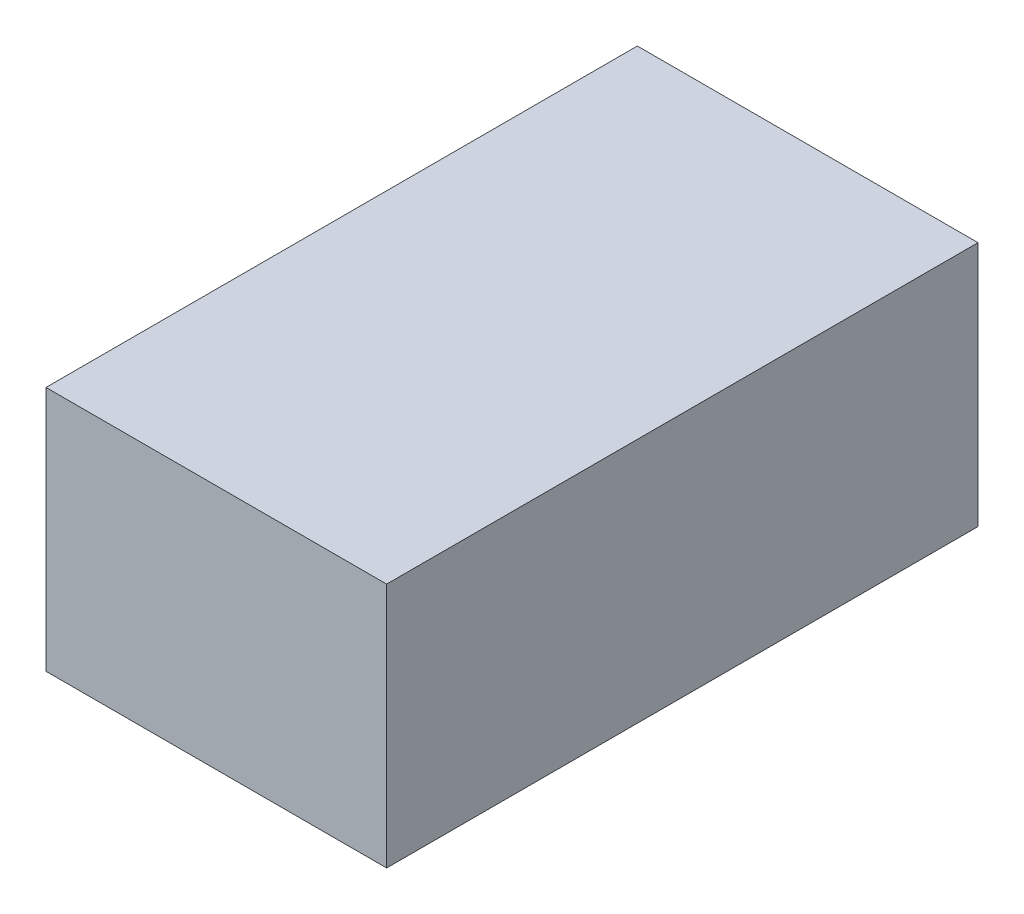
ISO-10303-21;
HEADER;
FILE_DESCRIPTION(('STEP AP214'),'2;1');
FILE_NAME('part.step','',(''),(''),'','','');
FILE_SCHEMA(('AUTOMOTIVE_DESIGN { 1 0 10303 214 1 1 1 1 }'));
ENDSEC;
DATA;
#1=APPLICATION_CONTEXT('core data for automotive mechanical design processes');
#2=APPLICATION_PROTOCOL_DEFINITION('international standard','automotive_design',2000,#1);
#3=PRODUCT_CONTEXT('',#1,'mechanical');
#4=PRODUCT('Part','Part','',(#3));
#5=PRODUCT_RELATED_PRODUCT_CATEGORY('part','',(#4));
#6=PRODUCT_DEFINITION_FORMATION('','',#4);
#7=PRODUCT_DEFINITION_CONTEXT('part definition',#1,'design');
#8=PRODUCT_DEFINITION('design','',#6,#7);
#9=PRODUCT_DEFINITION_SHAPE('','',#8);
#10=(LENGTH_UNIT() NAMED_UNIT(*) SI_UNIT(.MILLI.,.METRE.));
#11=(NAMED_UNIT(*) PLANE_ANGLE_UNIT() SI_UNIT($,.RADIAN.));
#12=(NAMED_UNIT(*) SI_UNIT($,.STERADIAN.) SOLID_ANGLE_UNIT());
#13=UNCERTAINTY_MEASURE_WITH_UNIT(LENGTH_MEASURE(1.E-05),#10,'distance_accuracy_value','');
#14=(GEOMETRIC_REPRESENTATION_CONTEXT(3) GLOBAL_UNCERTAINTY_ASSIGNED_CONTEXT((#13)) GLOBAL_UNIT_ASSIGNED_CONTEXT((#10,
#11,#12)) REPRESENTATION_CONTEXT('',''));
#15=CARTESIAN_POINT('',(0.,0.,0.));
#16=DIRECTION('',(0.,0.,1.));
#17=DIRECTION('',(1.,0.,0.));
#18=AXIS2_PLACEMENT_3D('',#15,#16,#17);
#19=CARTESIAN_POINT('',(0.,0.,0.));
#20=DIRECTION('',(0.,0.,1.));
#21=DIRECTION('',(1.,0.,0.));
#22=AXIS2_PLACEMENT_3D('',#19,#20,#21);
#23=PLANE('',#22);
#24=DIRECTION('',(0.,-1.,0.));
#25=VECTOR('',#24,1.);
#26=CARTESIAN_POINT('',(-15.9063444108761,15.7099697885196,0.));
#27=LINE('',#26,#25);
#28=CARTESIAN_POINT('',(-15.9063444108761,15.7099697885196,0.));
#29=VERTEX_POINT('',#28);
#30=CARTESIAN_POINT('',(-15.9063444108761,-4.87009063444108,0.));
#31=VERTEX_POINT('',#30);
#32=EDGE_CURVE('E141',#29,#31,#27,.T.);
#33=ORIENTED_EDGE('',*,*,#32,.F.);
#34=DIRECTION('',(-1.,0.,0.));
#35=VECTOR('',#34,1.);
#36=CARTESIAN_POINT('',(-15.9063444108761,15.7099697885196,0.));
#37=LINE('',#36,#35);
#38=CARTESIAN_POINT('',(12.607250755287,15.7099697885196,0.));
#39=VERTEX_POINT('',#38);
#40=EDGE_CURVE('E68',#39,#29,#37,.T.);
#41=ORIENTED_EDGE('',*,*,#40,.F.);
#42=DIRECTION('',(0.,1.,0.));
#43=VECTOR('',#42,1.);
#44=CARTESIAN_POINT('',(12.607250755287,15.7099697885196,0.));
#45=LINE('',#44,#43);
#46=CARTESIAN_POINT('',(12.607250755287,-4.87009063444108,0.));
#47=VERTEX_POINT('',#46);
#48=EDGE_CURVE('E255',#47,#39,#45,.T.);
#49=ORIENTED_EDGE('',*,*,#48,.F.);
#50=DIRECTION('',(1.,0.,0.));
#51=VECTOR('',#50,1.);
#52=CARTESIAN_POINT('',(-15.9063444108761,-4.87009063444108,0.));
#53=LINE('',#52,#51);
#54=EDGE_CURVE('E252',#31,#47,#53,.T.);
#55=ORIENTED_EDGE('',*,*,#54,.F.);
#56=EDGE_LOOP('',(#33,#41,#49,#55));
#57=FACE_BOUND('',#56,.T.);
#58=CARTESIAN_POINT('',(-12.6495468277946,12.5317220543807,0.));
#59=DIRECTION('',(0.,0.,1.));
#60=DIRECTION('',(-1.,0.,0.));
#61=AXIS2_PLACEMENT_3D('',#58,#59,#60);
#62=CIRCLE('',#61,2.);
#63=CARTESIAN_POINT('',(-12.6495468277945,14.5317220543807,0.));
#64=VERTEX_POINT('',#63);
#65=CARTESIAN_POINT('',(-14.6495468277946,12.5317220543806,0.));
#66=VERTEX_POINT('',#65);
#67=EDGE_CURVE('E60',#64,#66,#62,.T.);
#68=ORIENTED_EDGE('',*,*,#67,.T.);
#69=DIRECTION('',(0.,-1.,0.));
#70=VECTOR('',#69,1.);
#71=CARTESIAN_POINT('',(-14.6495468277946,12.5317220543806,0.));
#72=LINE('',#71,#70);
#73=CARTESIAN_POINT('',(-14.6495468277946,-0.568277945619327,0.));
#74=VERTEX_POINT('',#73);
#75=EDGE_CURVE('E200',#66,#74,#72,.T.);
#76=ORIENTED_EDGE('',*,*,#75,.T.);
#77=CARTESIAN_POINT('',(-12.6495468277946,-0.568277945619341,0.));
#78=DIRECTION('',(0.,0.,1.));
#79=DIRECTION('',(-1.,0.,0.));
#80=AXIS2_PLACEMENT_3D('',#77,#78,#79);
#81=CIRCLE('',#80,2.);
#82=CARTESIAN_POINT('',(-12.6495468277945,-2.56827794561934,0.));
#83=VERTEX_POINT('',#82);
#84=EDGE_CURVE('E204',#74,#83,#81,.T.);
#85=ORIENTED_EDGE('',*,*,#84,.T.);
#86=DIRECTION('',(1.,0.,0.));
#87=VECTOR('',#86,1.);
#88=CARTESIAN_POINT('',(-12.6495468277945,-2.56827794561934,0.));
#89=LINE('',#88,#87);
#90=CARTESIAN_POINT('',(9.35045317220542,-2.56827794561934,0.));
#91=VERTEX_POINT('',#90);
#92=EDGE_CURVE('E208',#83,#91,#89,.T.);
#93=ORIENTED_EDGE('',*,*,#92,.T.);
#94=CARTESIAN_POINT('',(9.35045317220544,-0.568277945619341,0.));
#95=DIRECTION('',(0.,0.,1.));
#96=DIRECTION('',(-1.,0.,0.));
#97=AXIS2_PLACEMENT_3D('',#94,#95,#96);
#98=CIRCLE('',#97,2.);
#99=CARTESIAN_POINT('',(11.3504531722054,-0.568277945619327,0.));
#100=VERTEX_POINT('',#99);
#101=EDGE_CURVE('E212',#91,#100,#98,.T.);
#102=ORIENTED_EDGE('',*,*,#101,.T.);
#103=DIRECTION('',(0.,1.,0.));
#104=VECTOR('',#103,1.);
#105=CARTESIAN_POINT('',(11.3504531722054,12.5317220543806,0.));
#106=LINE('',#105,#104);
#107=CARTESIAN_POINT('',(11.3504531722054,12.5317220543806,0.));
#108=VERTEX_POINT('',#107);
#109=EDGE_CURVE('E216',#100,#108,#106,.T.);
#110=ORIENTED_EDGE('',*,*,#109,.T.);
#111=CARTESIAN_POINT('',(9.35045317220544,12.5317220543807,0.));
#112=DIRECTION('',(0.,0.,1.));
#113=DIRECTION('',(1.,0.,0.));
#114=AXIS2_PLACEMENT_3D('',#111,#112,#113);
#115=CIRCLE('',#114,2.);
#116=CARTESIAN_POINT('',(9.35045317220542,14.5317220543807,0.));
#117=VERTEX_POINT('',#116);
#118=EDGE_CURVE('E220',#108,#117,#115,.T.);
#119=ORIENTED_EDGE('',*,*,#118,.T.);
#120=DIRECTION('',(-1.,0.,0.));
#121=VECTOR('',#120,1.);
#122=CARTESIAN_POINT('',(-12.6495468277945,14.5317220543807,0.));
#123=LINE('',#122,#121);
#124=EDGE_CURVE('E169',#117,#64,#123,.T.);
#125=ORIENTED_EDGE('',*,*,#124,.T.);
#126=EDGE_LOOP('',(#68,#76,#85,#93,#102,#110,#119,#125));
#127=FACE_BOUND('',#126,.T.);
#128=ADVANCED_FACE('F44',(#57,#127),#23,.F.);
#129=CARTESIAN_POINT('',(-15.9063444108761,15.7099697885196,46.5));
#130=DIRECTION('',(1.,0.,0.));
#131=DIRECTION('',(0.,0.,-1.));
#132=AXIS2_PLACEMENT_3D('',#129,#130,#131);
#133=PLANE('',#132);
#134=ORIENTED_EDGE('',*,*,#32,.T.);
#135=DIRECTION('',(0.,0.,-1.));
#136=VECTOR('',#135,1.);
#137=CARTESIAN_POINT('',(-15.9063444108761,-4.87009063444108,46.5));
#138=LINE('',#137,#136);
#139=CARTESIAN_POINT('',(-15.9063444108761,-4.87009063444108,49.5));
#140=VERTEX_POINT('',#139);
#141=EDGE_CURVE('E11',#140,#31,#138,.T.);
#142=ORIENTED_EDGE('',*,*,#141,.F.);
#143=DIRECTION('',(0.,-1.,0.));
#144=VECTOR('',#143,1.);
#145=CARTESIAN_POINT('',(-15.9063444108761,15.7099697885196,49.5));
#146=LINE('',#145,#144);
#147=CARTESIAN_POINT('',(-15.9063444108761,15.7099697885196,49.5));
#148=VERTEX_POINT('',#147);
#149=EDGE_CURVE('E139',#148,#140,#146,.T.);
#150=ORIENTED_EDGE('',*,*,#149,.F.);
#151=DIRECTION('',(0.,0.,-1.));
#152=VECTOR('',#151,1.);
#153=CARTESIAN_POINT('',(-15.9063444108761,15.7099697885196,46.5));
#154=LINE('',#153,#152);
#155=EDGE_CURVE('E260',#148,#29,#154,.T.);
#156=ORIENTED_EDGE('',*,*,#155,.T.);
#157=EDGE_LOOP('',(#134,#142,#150,#156));
#158=FACE_BOUND('',#157,.T.);
#159=ADVANCED_FACE('F46',(#158),#133,.F.);
#160=CARTESIAN_POINT('',(-15.9063444108761,-4.87009063444108,46.5));
#161=DIRECTION('',(0.,1.,0.));
#162=DIRECTION('',(0.,0.,1.));
#163=AXIS2_PLACEMENT_3D('',#160,#161,#162);
#164=PLANE('',#163);
#165=ORIENTED_EDGE('',*,*,#54,.T.);
#166=DIRECTION('',(0.,0.,-1.));
#167=VECTOR('',#166,1.);
#168=CARTESIAN_POINT('',(12.607250755287,-4.87009063444108,46.5));
#169=LINE('',#168,#167);
#170=CARTESIAN_POINT('',(12.607250755287,-4.87009063444108,49.5));
#171=VERTEX_POINT('',#170);
#172=EDGE_CURVE('E53',#171,#47,#169,.T.);
#173=ORIENTED_EDGE('',*,*,#172,.F.);
#174=DIRECTION('',(1.,0.,0.));
#175=VECTOR('',#174,1.);
#176=CARTESIAN_POINT('',(-15.9063444108761,-4.87009063444108,49.5));
#177=LINE('',#176,#175);
#178=EDGE_CURVE('E144',#140,#171,#177,.T.);
#179=ORIENTED_EDGE('',*,*,#178,.F.);
#180=ORIENTED_EDGE('',*,*,#141,.T.);
#181=EDGE_LOOP('',(#165,#173,#179,#180));
#182=FACE_BOUND('',#181,.T.);
#183=ADVANCED_FACE('F145',(#182),#164,.F.);
#184=CARTESIAN_POINT('',(12.607250755287,15.7099697885196,46.5));
#185=DIRECTION('',(-1.,0.,0.));
#186=DIRECTION('',(0.,0.,1.));
#187=AXIS2_PLACEMENT_3D('',#184,#185,#186);
#188=PLANE('',#187);
#189=ORIENTED_EDGE('',*,*,#48,.T.);
#190=DIRECTION('',(0.,0.,-1.));
#191=VECTOR('',#190,1.);
#192=CARTESIAN_POINT('',(12.607250755287,15.7099697885196,46.5));
#193=LINE('',#192,#191);
#194=CARTESIAN_POINT('',(12.607250755287,15.7099697885196,49.5));
#195=VERTEX_POINT('',#194);
#196=EDGE_CURVE('E263',#195,#39,#193,.T.);
#197=ORIENTED_EDGE('',*,*,#196,.F.);
#198=DIRECTION('',(0.,1.,0.));
#199=VECTOR('',#198,1.);
#200=CARTESIAN_POINT('',(12.607250755287,15.7099697885196,49.5));
#201=LINE('',#200,#199);
#202=EDGE_CURVE('E151',#171,#195,#201,.T.);
#203=ORIENTED_EDGE('',*,*,#202,.F.);
#204=ORIENTED_EDGE('',*,*,#172,.T.);
#205=EDGE_LOOP('',(#189,#197,#203,#204));
#206=FACE_BOUND('',#205,.T.);
#207=ADVANCED_FACE('F268',(#206),#188,.F.);
#208=CARTESIAN_POINT('',(-15.9063444108761,15.7099697885196,46.5));
#209=DIRECTION('',(0.,-1.,0.));
#210=DIRECTION('',(0.,0.,-1.));
#211=AXIS2_PLACEMENT_3D('',#208,#209,#210);
#212=PLANE('',#211);
#213=ORIENTED_EDGE('',*,*,#40,.T.);
#214=ORIENTED_EDGE('',*,*,#155,.F.);
#215=DIRECTION('',(-1.,0.,0.));
#216=VECTOR('',#215,1.);
#217=CARTESIAN_POINT('',(-15.9063444108761,15.7099697885196,49.5));
#218=LINE('',#217,#216);
#219=EDGE_CURVE('E156',#195,#148,#218,.T.);
#220=ORIENTED_EDGE('',*,*,#219,.F.);
#221=ORIENTED_EDGE('',*,*,#196,.T.);
#222=EDGE_LOOP('',(#213,#214,#220,#221));
#223=FACE_BOUND('',#222,.T.);
#224=ADVANCED_FACE('F325',(#223),#212,.F.);
#225=CARTESIAN_POINT('',(-12.6495468277946,12.5317220543807,46.5));
#226=DIRECTION('',(0.,0.,-1.));
#227=DIRECTION('',(-1.,0.,0.));
#228=AXIS2_PLACEMENT_3D('',#225,#226,#227);
#229=CYLINDRICAL_SURFACE('',#228,2.);
#230=ORIENTED_EDGE('',*,*,#67,.F.);
#231=DIRECTION('',(0.,0.,-1.));
#232=VECTOR('',#231,1.);
#233=CARTESIAN_POINT('',(-12.6495468277945,14.5317220543807,46.5));
#234=LINE('',#233,#232);
#235=CARTESIAN_POINT('',(-12.6495468277945,14.5317220543807,46.5));
#236=VERTEX_POINT('',#235);
#237=EDGE_CURVE('E197',#236,#64,#234,.T.);
#238=ORIENTED_EDGE('',*,*,#237,.F.);
#239=CARTESIAN_POINT('',(-12.6495468277946,12.5317220543807,46.5));
#240=DIRECTION('',(0.,0.,1.));
#241=DIRECTION('',(-1.,0.,0.));
#242=AXIS2_PLACEMENT_3D('',#239,#240,#241);
#243=CIRCLE('',#242,2.);
#244=CARTESIAN_POINT('',(-14.6495468277946,12.5317220543806,46.5));
#245=VERTEX_POINT('',#244);
#246=EDGE_CURVE('E164',#236,#245,#243,.T.);
#247=ORIENTED_EDGE('',*,*,#246,.T.);
#248=DIRECTION('',(0.,0.,-1.));
#249=VECTOR('',#248,1.);
#250=CARTESIAN_POINT('',(-14.6495468277946,12.5317220543806,46.5));
#251=LINE('',#250,#249);
#252=EDGE_CURVE('E247',#245,#66,#251,.T.);
#253=ORIENTED_EDGE('',*,*,#252,.T.);
#254=EDGE_LOOP('',(#230,#238,#247,#253));
#255=FACE_BOUND('',#254,.T.);
#256=ADVANCED_FACE('F278',(#255),#229,.F.);
#257=CARTESIAN_POINT('',(-14.6495468277946,12.5317220543806,46.5));
#258=DIRECTION('',(1.,0.,0.));
#259=DIRECTION('',(0.,1.,0.));
#260=AXIS2_PLACEMENT_3D('',#257,#258,#259);
#261=PLANE('',#260);
#262=ORIENTED_EDGE('',*,*,#75,.F.);
#263=ORIENTED_EDGE('',*,*,#252,.F.);
#264=DIRECTION('',(0.,-1.,0.));
#265=VECTOR('',#264,1.);
#266=CARTESIAN_POINT('',(-14.6495468277946,12.5317220543806,46.5));
#267=LINE('',#266,#265);
#268=CARTESIAN_POINT('',(-14.6495468277946,-0.568277945619327,46.5));
#269=VERTEX_POINT('',#268);
#270=EDGE_CURVE('E168',#245,#269,#267,.T.);
#271=ORIENTED_EDGE('',*,*,#270,.T.);
#272=DIRECTION('',(0.,0.,-1.));
#273=VECTOR('',#272,1.);
#274=CARTESIAN_POINT('',(-14.6495468277946,-0.568277945619327,46.5));
#275=LINE('',#274,#273);
#276=EDGE_CURVE('E244',#269,#74,#275,.T.);
#277=ORIENTED_EDGE('',*,*,#276,.T.);
#278=EDGE_LOOP('',(#262,#263,#271,#277));
#279=FACE_BOUND('',#278,.T.);
#280=ADVANCED_FACE('F282',(#279),#261,.T.);
#281=CARTESIAN_POINT('',(-12.6495468277946,-0.568277945619341,46.5));
#282=DIRECTION('',(0.,0.,-1.));
#283=DIRECTION('',(-1.,0.,0.));
#284=AXIS2_PLACEMENT_3D('',#281,#282,#283);
#285=CYLINDRICAL_SURFACE('',#284,2.);
#286=ORIENTED_EDGE('',*,*,#84,.F.);
#287=ORIENTED_EDGE('',*,*,#276,.F.);
#288=CARTESIAN_POINT('',(-12.6495468277946,-0.568277945619341,46.5));
#289=DIRECTION('',(0.,0.,1.));
#290=DIRECTION('',(-1.,0.,0.));
#291=AXIS2_PLACEMENT_3D('',#288,#289,#290);
#292=CIRCLE('',#291,2.);
#293=CARTESIAN_POINT('',(-12.6495468277945,-2.56827794561934,46.5));
#294=VERTEX_POINT('',#293);
#295=EDGE_CURVE('E173',#269,#294,#292,.T.);
#296=ORIENTED_EDGE('',*,*,#295,.T.);
#297=DIRECTION('',(0.,0.,-1.));
#298=VECTOR('',#297,1.);
#299=CARTESIAN_POINT('',(-12.6495468277945,-2.56827794561934,46.5));
#300=LINE('',#299,#298);
#301=EDGE_CURVE('E241',#294,#83,#300,.T.);
#302=ORIENTED_EDGE('',*,*,#301,.T.);
#303=EDGE_LOOP('',(#286,#287,#296,#302));
#304=FACE_BOUND('',#303,.T.);
#305=ADVANCED_FACE('F286',(#304),#285,.F.);
#306=CARTESIAN_POINT('',(-12.6495468277945,-2.56827794561934,46.5));
#307=DIRECTION('',(0.,1.,0.));
#308=DIRECTION('',(0.,0.,1.));
#309=AXIS2_PLACEMENT_3D('',#306,#307,#308);
#310=PLANE('',#309);
#311=ORIENTED_EDGE('',*,*,#92,.F.);
#312=ORIENTED_EDGE('',*,*,#301,.F.);
#313=DIRECTION('',(1.,0.,0.));
#314=VECTOR('',#313,1.);
#315=CARTESIAN_POINT('',(-12.6495468277945,-2.56827794561934,46.5));
#316=LINE('',#315,#314);
#317=CARTESIAN_POINT('',(9.35045317220542,-2.56827794561934,46.5));
#318=VERTEX_POINT('',#317);
#319=EDGE_CURVE('E177',#294,#318,#316,.T.);
#320=ORIENTED_EDGE('',*,*,#319,.T.);
#321=DIRECTION('',(0.,0.,-1.));
#322=VECTOR('',#321,1.);
#323=CARTESIAN_POINT('',(9.35045317220542,-2.56827794561934,46.5));
#324=LINE('',#323,#322);
#325=EDGE_CURVE('E238',#318,#91,#324,.T.);
#326=ORIENTED_EDGE('',*,*,#325,.T.);
#327=EDGE_LOOP('',(#311,#312,#320,#326));
#328=FACE_BOUND('',#327,.T.);
#329=ADVANCED_FACE('F291',(#328),#310,.T.);
#330=CARTESIAN_POINT('',(9.35045317220544,-0.568277945619341,46.5));
#331=DIRECTION('',(0.,0.,-1.));
#332=DIRECTION('',(-1.,0.,0.));
#333=AXIS2_PLACEMENT_3D('',#330,#331,#332);
#334=CYLINDRICAL_SURFACE('',#333,2.);
#335=ORIENTED_EDGE('',*,*,#101,.F.);
#336=ORIENTED_EDGE('',*,*,#325,.F.);
#337=CARTESIAN_POINT('',(9.35045317220544,-0.568277945619341,46.5));
#338=DIRECTION('',(0.,0.,1.));
#339=DIRECTION('',(-1.,0.,0.));
#340=AXIS2_PLACEMENT_3D('',#337,#338,#339);
#341=CIRCLE('',#340,2.);
#342=CARTESIAN_POINT('',(11.3504531722054,-0.568277945619327,46.5));
#343=VERTEX_POINT('',#342);
#344=EDGE_CURVE('E181',#318,#343,#341,.T.);
#345=ORIENTED_EDGE('',*,*,#344,.T.);
#346=DIRECTION('',(0.,0.,-1.));
#347=VECTOR('',#346,1.);
#348=CARTESIAN_POINT('',(11.3504531722054,-0.568277945619327,46.5));
#349=LINE('',#348,#347);
#350=EDGE_CURVE('E235',#343,#100,#349,.T.);
#351=ORIENTED_EDGE('',*,*,#350,.T.);
#352=EDGE_LOOP('',(#335,#336,#345,#351));
#353=FACE_BOUND('',#352,.T.);
#354=ADVANCED_FACE('F294',(#353),#334,.F.);
#355=CARTESIAN_POINT('',(11.3504531722054,12.5317220543806,46.5));
#356=DIRECTION('',(-1.,0.,0.));
#357=DIRECTION('',(0.,-1.,0.));
#358=AXIS2_PLACEMENT_3D('',#355,#356,#357);
#359=PLANE('',#358);
#360=ORIENTED_EDGE('',*,*,#109,.F.);
#361=ORIENTED_EDGE('',*,*,#350,.F.);
#362=DIRECTION('',(0.,1.,0.));
#363=VECTOR('',#362,1.);
#364=CARTESIAN_POINT('',(11.3504531722054,12.5317220543806,46.5));
#365=LINE('',#364,#363);
#366=CARTESIAN_POINT('',(11.3504531722054,12.5317220543806,46.5));
#367=VERTEX_POINT('',#366);
#368=EDGE_CURVE('E185',#343,#367,#365,.T.);
#369=ORIENTED_EDGE('',*,*,#368,.T.);
#370=DIRECTION('',(0.,0.,-1.));
#371=VECTOR('',#370,1.);
#372=CARTESIAN_POINT('',(11.3504531722054,12.5317220543806,46.5));
#373=LINE('',#372,#371);
#374=EDGE_CURVE('E232',#367,#108,#373,.T.);
#375=ORIENTED_EDGE('',*,*,#374,.T.);
#376=EDGE_LOOP('',(#360,#361,#369,#375));
#377=FACE_BOUND('',#376,.T.);
#378=ADVANCED_FACE('F298',(#377),#359,.T.);
#379=CARTESIAN_POINT('',(9.35045317220544,12.5317220543807,46.5));
#380=DIRECTION('',(0.,0.,-1.));
#381=DIRECTION('',(-1.,0.,0.));
#382=AXIS2_PLACEMENT_3D('',#379,#380,#381);
#383=CYLINDRICAL_SURFACE('',#382,2.);
#384=ORIENTED_EDGE('',*,*,#118,.F.);
#385=ORIENTED_EDGE('',*,*,#374,.F.);
#386=CARTESIAN_POINT('',(9.35045317220544,12.5317220543807,46.5));
#387=DIRECTION('',(0.,0.,1.));
#388=DIRECTION('',(1.,0.,0.));
#389=AXIS2_PLACEMENT_3D('',#386,#387,#388);
#390=CIRCLE('',#389,2.);
#391=CARTESIAN_POINT('',(9.35045317220542,14.5317220543807,46.5));
#392=VERTEX_POINT('',#391);
#393=EDGE_CURVE('E189',#367,#392,#390,.T.);
#394=ORIENTED_EDGE('',*,*,#393,.T.);
#395=DIRECTION('',(0.,0.,-1.));
#396=VECTOR('',#395,1.);
#397=CARTESIAN_POINT('',(9.35045317220542,14.5317220543807,46.5));
#398=LINE('',#397,#396);
#399=EDGE_CURVE('E229',#392,#117,#398,.T.);
#400=ORIENTED_EDGE('',*,*,#399,.T.);
#401=EDGE_LOOP('',(#384,#385,#394,#400));
#402=FACE_BOUND('',#401,.T.);
#403=ADVANCED_FACE('F301',(#402),#383,.F.);
#404=CARTESIAN_POINT('',(-12.6495468277945,14.5317220543807,46.5));
#405=DIRECTION('',(0.,-1.,0.));
#406=DIRECTION('',(0.,0.,-1.));
#407=AXIS2_PLACEMENT_3D('',#404,#405,#406);
#408=PLANE('',#407);
#409=ORIENTED_EDGE('',*,*,#124,.F.);
#410=ORIENTED_EDGE('',*,*,#399,.F.);
#411=DIRECTION('',(-1.,0.,0.));
#412=VECTOR('',#411,1.);
#413=CARTESIAN_POINT('',(-12.6495468277945,14.5317220543807,46.5));
#414=LINE('',#413,#412);
#415=EDGE_CURVE('E193',#392,#236,#414,.T.);
#416=ORIENTED_EDGE('',*,*,#415,.T.);
#417=ORIENTED_EDGE('',*,*,#237,.T.);
#418=EDGE_LOOP('',(#409,#410,#416,#417));
#419=FACE_BOUND('',#418,.T.);
#420=ADVANCED_FACE('F277',(#419),#408,.T.);
#421=CARTESIAN_POINT('',(0.,0.,46.5));
#422=DIRECTION('',(0.,0.,1.));
#423=DIRECTION('',(1.,0.,0.));
#424=AXIS2_PLACEMENT_3D('',#421,#422,#423);
#425=PLANE('',#424);
#426=ORIENTED_EDGE('',*,*,#270,.F.);
#427=ORIENTED_EDGE('',*,*,#246,.F.);
#428=ORIENTED_EDGE('',*,*,#415,.F.);
#429=ORIENTED_EDGE('',*,*,#393,.F.);
#430=ORIENTED_EDGE('',*,*,#368,.F.);
#431=ORIENTED_EDGE('',*,*,#344,.F.);
#432=ORIENTED_EDGE('',*,*,#319,.F.);
#433=ORIENTED_EDGE('',*,*,#295,.F.);
#434=EDGE_LOOP('',(#426,#427,#428,#429,#430,#431,#432,#433));
#435=FACE_BOUND('',#434,.T.);
#436=ADVANCED_FACE('F302',(#435),#425,.F.);
#437=CARTESIAN_POINT('',(0.,0.,49.5));
#438=DIRECTION('',(0.,0.,1.));
#439=DIRECTION('',(1.,0.,0.));
#440=AXIS2_PLACEMENT_3D('',#437,#438,#439);
#441=PLANE('',#440);
#442=ORIENTED_EDGE('',*,*,#149,.T.);
#443=ORIENTED_EDGE('',*,*,#178,.T.);
#444=ORIENTED_EDGE('',*,*,#202,.T.);
#445=ORIENTED_EDGE('',*,*,#219,.T.);
#446=EDGE_LOOP('',(#442,#443,#444,#445));
#447=FACE_BOUND('',#446,.T.);
#448=ADVANCED_FACE('F154',(#447),#441,.T.);
#449=CLOSED_SHELL('',(#128,#159,#183,#207,#224,#256,#280,#305,#329,#354,#378,#403,#420,#436,#448));
#450=MANIFOLD_SOLID_BREP('B2',#449);
#451=ADVANCED_BREP_SHAPE_REPRESENTATION('',(#18,#450),#14);
#452=SHAPE_DEFINITION_REPRESENTATION(#9,#451);
ENDSEC;
END-ISO-10303-21;
